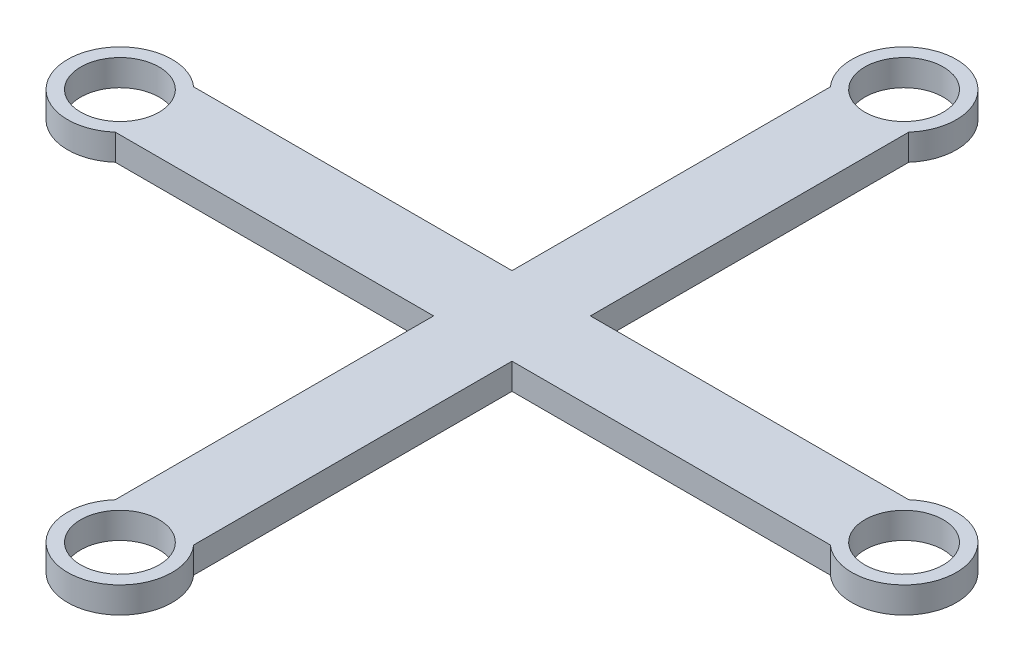
ISO-10303-21;
HEADER;
FILE_DESCRIPTION(('STEP AP214'),'2;1');
FILE_NAME('part.step','',(''),(''),'','','');
FILE_SCHEMA(('AUTOMOTIVE_DESIGN { 1 0 10303 214 1 1 1 1 }'));
ENDSEC;
DATA;
#1=APPLICATION_CONTEXT('core data for automotive mechanical design processes');
#2=APPLICATION_PROTOCOL_DEFINITION('international standard','automotive_design',2000,#1);
#3=PRODUCT_CONTEXT('',#1,'mechanical');
#4=PRODUCT('Part','Part','',(#3));
#5=PRODUCT_RELATED_PRODUCT_CATEGORY('part','',(#4));
#6=PRODUCT_DEFINITION_FORMATION('','',#4);
#7=PRODUCT_DEFINITION_CONTEXT('part definition',#1,'design');
#8=PRODUCT_DEFINITION('design','',#6,#7);
#9=PRODUCT_DEFINITION_SHAPE('','',#8);
#10=(LENGTH_UNIT() NAMED_UNIT(*) SI_UNIT(.MILLI.,.METRE.));
#11=(NAMED_UNIT(*) PLANE_ANGLE_UNIT() SI_UNIT($,.RADIAN.));
#12=(NAMED_UNIT(*) SI_UNIT($,.STERADIAN.) SOLID_ANGLE_UNIT());
#13=UNCERTAINTY_MEASURE_WITH_UNIT(LENGTH_MEASURE(1.E-05),#10,'distance_accuracy_value','');
#14=(GEOMETRIC_REPRESENTATION_CONTEXT(3) GLOBAL_UNCERTAINTY_ASSIGNED_CONTEXT((#13)) GLOBAL_UNIT_ASSIGNED_CONTEXT((#10,
#11,#12)) REPRESENTATION_CONTEXT('',''));
#15=CARTESIAN_POINT('',(0.,0.,0.));
#16=DIRECTION('',(0.,0.,1.));
#17=DIRECTION('',(1.,0.,0.));
#18=AXIS2_PLACEMENT_3D('',#15,#16,#17);
#19=CARTESIAN_POINT('',(-15.,10.,0.));
#20=DIRECTION('',(-1.,0.,0.));
#21=DIRECTION('',(0.,0.,1.));
#22=AXIS2_PLACEMENT_3D('',#19,#20,#21);
#23=PLANE('',#22);
#24=DIRECTION('',(0.,0.,-1.));
#25=VECTOR('',#24,1.);
#26=CARTESIAN_POINT('',(-15.,0.,0.));
#27=LINE('',#26,#25);
#28=CARTESIAN_POINT('',(-15.,0.,136.771243444677));
#29=VERTEX_POINT('',#28);
#30=CARTESIAN_POINT('',(-15.,0.,15.));
#31=VERTEX_POINT('',#30);
#32=EDGE_CURVE('E174',#29,#31,#27,.T.);
#33=ORIENTED_EDGE('',*,*,#32,.F.);
#34=DIRECTION('',(0.,-1.,0.));
#35=VECTOR('',#34,1.);
#36=CARTESIAN_POINT('',(-15.,10.,136.771243444677));
#37=LINE('',#36,#35);
#38=CARTESIAN_POINT('',(-15.,10.,136.771243444677));
#39=VERTEX_POINT('',#38);
#40=EDGE_CURVE('E11',#39,#29,#37,.T.);
#41=ORIENTED_EDGE('',*,*,#40,.F.);
#42=DIRECTION('',(0.,0.,-1.));
#43=VECTOR('',#42,1.);
#44=CARTESIAN_POINT('',(-15.,10.,0.));
#45=LINE('',#44,#43);
#46=CARTESIAN_POINT('',(-15.,10.,15.));
#47=VERTEX_POINT('',#46);
#48=EDGE_CURVE('E306',#39,#47,#45,.T.);
#49=ORIENTED_EDGE('',*,*,#48,.T.);
#50=DIRECTION('',(0.,-1.,0.));
#51=VECTOR('',#50,1.);
#52=CARTESIAN_POINT('',(-15.,10.,15.));
#53=LINE('',#52,#51);
#54=EDGE_CURVE('E103',#47,#31,#53,.T.);
#55=ORIENTED_EDGE('',*,*,#54,.T.);
#56=EDGE_LOOP('',(#33,#41,#49,#55));
#57=FACE_BOUND('',#56,.T.);
#58=ADVANCED_FACE('F39',(#57),#23,.T.);
#59=CARTESIAN_POINT('',(0.,10.,150.));
#60=DIRECTION('',(0.,-1.,0.));
#61=DIRECTION('',(0.,0.,-1.));
#62=AXIS2_PLACEMENT_3D('',#59,#60,#61);
#63=CYLINDRICAL_SURFACE('',#62,20.);
#64=CARTESIAN_POINT('',(0.,0.,150.));
#65=DIRECTION('',(0.,1.,0.));
#66=DIRECTION('',(0.,0.,1.));
#67=AXIS2_PLACEMENT_3D('',#64,#65,#66);
#68=CIRCLE('',#67,20.);
#69=CARTESIAN_POINT('',(15.,0.,136.771243444677));
#70=VERTEX_POINT('',#69);
#71=EDGE_CURVE('E176',#29,#70,#68,.T.);
#72=ORIENTED_EDGE('',*,*,#71,.T.);
#73=DIRECTION('',(0.,-1.,0.));
#74=VECTOR('',#73,1.);
#75=CARTESIAN_POINT('',(15.,10.,136.771243444677));
#76=LINE('',#75,#74);
#77=CARTESIAN_POINT('',(15.,10.,136.771243444677));
#78=VERTEX_POINT('',#77);
#79=EDGE_CURVE('E48',#78,#70,#76,.T.);
#80=ORIENTED_EDGE('',*,*,#79,.F.);
#81=CARTESIAN_POINT('',(0.,10.,150.));
#82=DIRECTION('',(0.,1.,0.));
#83=DIRECTION('',(0.,0.,1.));
#84=AXIS2_PLACEMENT_3D('',#81,#82,#83);
#85=CIRCLE('',#84,20.);
#86=EDGE_CURVE('E308',#39,#78,#85,.T.);
#87=ORIENTED_EDGE('',*,*,#86,.F.);
#88=ORIENTED_EDGE('',*,*,#40,.T.);
#89=EDGE_LOOP('',(#72,#80,#87,#88));
#90=FACE_BOUND('',#89,.T.);
#91=ADVANCED_FACE('F241',(#90),#63,.T.);
#92=CARTESIAN_POINT('',(15.,10.,0.));
#93=DIRECTION('',(-1.,0.,0.));
#94=DIRECTION('',(0.,0.,1.));
#95=AXIS2_PLACEMENT_3D('',#92,#93,#94);
#96=PLANE('',#95);
#97=DIRECTION('',(0.,0.,-1.));
#98=VECTOR('',#97,1.);
#99=CARTESIAN_POINT('',(15.,0.,0.));
#100=LINE('',#99,#98);
#101=CARTESIAN_POINT('',(15.,0.,15.));
#102=VERTEX_POINT('',#101);
#103=EDGE_CURVE('E179',#70,#102,#100,.T.);
#104=ORIENTED_EDGE('',*,*,#103,.T.);
#105=DIRECTION('',(0.,-1.,0.));
#106=VECTOR('',#105,1.);
#107=CARTESIAN_POINT('',(15.,10.,15.));
#108=LINE('',#107,#106);
#109=CARTESIAN_POINT('',(15.,10.,15.));
#110=VERTEX_POINT('',#109);
#111=EDGE_CURVE('E229',#110,#102,#108,.T.);
#112=ORIENTED_EDGE('',*,*,#111,.F.);
#113=DIRECTION('',(0.,0.,-1.));
#114=VECTOR('',#113,1.);
#115=CARTESIAN_POINT('',(15.,10.,0.));
#116=LINE('',#115,#114);
#117=EDGE_CURVE('E237',#78,#110,#116,.T.);
#118=ORIENTED_EDGE('',*,*,#117,.F.);
#119=ORIENTED_EDGE('',*,*,#79,.T.);
#120=EDGE_LOOP('',(#104,#112,#118,#119));
#121=FACE_BOUND('',#120,.T.);
#122=ADVANCED_FACE('F234',(#121),#96,.F.);
#123=CARTESIAN_POINT('',(0.,10.,15.));
#124=DIRECTION('',(0.,0.,-1.));
#125=DIRECTION('',(-1.,0.,0.));
#126=AXIS2_PLACEMENT_3D('',#123,#124,#125);
#127=PLANE('',#126);
#128=DIRECTION('',(1.,0.,0.));
#129=VECTOR('',#128,1.);
#130=CARTESIAN_POINT('',(0.,0.,15.));
#131=LINE('',#130,#129);
#132=CARTESIAN_POINT('',(136.771243444677,0.,15.));
#133=VERTEX_POINT('',#132);
#134=EDGE_CURVE('E182',#102,#133,#131,.T.);
#135=ORIENTED_EDGE('',*,*,#134,.T.);
#136=DIRECTION('',(0.,-1.,0.));
#137=VECTOR('',#136,1.);
#138=CARTESIAN_POINT('',(136.771243444677,10.,15.));
#139=LINE('',#138,#137);
#140=CARTESIAN_POINT('',(136.771243444677,10.,15.));
#141=VERTEX_POINT('',#140);
#142=EDGE_CURVE('E226',#141,#133,#139,.T.);
#143=ORIENTED_EDGE('',*,*,#142,.F.);
#144=DIRECTION('',(1.,0.,0.));
#145=VECTOR('',#144,1.);
#146=CARTESIAN_POINT('',(0.,10.,15.));
#147=LINE('',#146,#145);
#148=EDGE_CURVE('E313',#110,#141,#147,.T.);
#149=ORIENTED_EDGE('',*,*,#148,.F.);
#150=ORIENTED_EDGE('',*,*,#111,.T.);
#151=EDGE_LOOP('',(#135,#143,#149,#150));
#152=FACE_BOUND('',#151,.T.);
#153=ADVANCED_FACE('F252',(#152),#127,.F.);
#154=CARTESIAN_POINT('',(150.,10.,0.));
#155=DIRECTION('',(0.,-1.,0.));
#156=DIRECTION('',(0.,0.,-1.));
#157=AXIS2_PLACEMENT_3D('',#154,#155,#156);
#158=CYLINDRICAL_SURFACE('',#157,20.);
#159=CARTESIAN_POINT('',(150.,0.,0.));
#160=DIRECTION('',(0.,1.,0.));
#161=DIRECTION('',(0.,0.,1.));
#162=AXIS2_PLACEMENT_3D('',#159,#160,#161);
#163=CIRCLE('',#162,20.);
#164=CARTESIAN_POINT('',(136.771243444677,0.,-15.));
#165=VERTEX_POINT('',#164);
#166=EDGE_CURVE('E185',#133,#165,#163,.T.);
#167=ORIENTED_EDGE('',*,*,#166,.T.);
#168=DIRECTION('',(0.,-1.,0.));
#169=VECTOR('',#168,1.);
#170=CARTESIAN_POINT('',(136.771243444677,10.,-15.));
#171=LINE('',#170,#169);
#172=CARTESIAN_POINT('',(136.771243444677,10.,-15.));
#173=VERTEX_POINT('',#172);
#174=EDGE_CURVE('E224',#173,#165,#171,.T.);
#175=ORIENTED_EDGE('',*,*,#174,.F.);
#176=CARTESIAN_POINT('',(150.,10.,0.));
#177=DIRECTION('',(0.,1.,0.));
#178=DIRECTION('',(0.,0.,1.));
#179=AXIS2_PLACEMENT_3D('',#176,#177,#178);
#180=CIRCLE('',#179,20.);
#181=EDGE_CURVE('E316',#141,#173,#180,.T.);
#182=ORIENTED_EDGE('',*,*,#181,.F.);
#183=ORIENTED_EDGE('',*,*,#142,.T.);
#184=EDGE_LOOP('',(#167,#175,#182,#183));
#185=FACE_BOUND('',#184,.T.);
#186=ADVANCED_FACE('F255',(#185),#158,.T.);
#187=CARTESIAN_POINT('',(0.,10.,-15.));
#188=DIRECTION('',(0.,0.,-1.));
#189=DIRECTION('',(-1.,0.,0.));
#190=AXIS2_PLACEMENT_3D('',#187,#188,#189);
#191=PLANE('',#190);
#192=DIRECTION('',(1.,0.,0.));
#193=VECTOR('',#192,1.);
#194=CARTESIAN_POINT('',(0.,0.,-15.));
#195=LINE('',#194,#193);
#196=CARTESIAN_POINT('',(15.,0.,-15.));
#197=VERTEX_POINT('',#196);
#198=EDGE_CURVE('E188',#197,#165,#195,.T.);
#199=ORIENTED_EDGE('',*,*,#198,.F.);
#200=DIRECTION('',(0.,-1.,0.));
#201=VECTOR('',#200,1.);
#202=CARTESIAN_POINT('',(15.,10.,-15.));
#203=LINE('',#202,#201);
#204=CARTESIAN_POINT('',(15.,10.,-15.));
#205=VERTEX_POINT('',#204);
#206=EDGE_CURVE('E222',#205,#197,#203,.T.);
#207=ORIENTED_EDGE('',*,*,#206,.F.);
#208=DIRECTION('',(1.,0.,0.));
#209=VECTOR('',#208,1.);
#210=CARTESIAN_POINT('',(0.,10.,-15.));
#211=LINE('',#210,#209);
#212=EDGE_CURVE('E318',#205,#173,#211,.T.);
#213=ORIENTED_EDGE('',*,*,#212,.T.);
#214=ORIENTED_EDGE('',*,*,#174,.T.);
#215=EDGE_LOOP('',(#199,#207,#213,#214));
#216=FACE_BOUND('',#215,.T.);
#217=ADVANCED_FACE('F259',(#216),#191,.T.);
#218=CARTESIAN_POINT('',(15.,10.,0.));
#219=DIRECTION('',(-1.,0.,0.));
#220=DIRECTION('',(0.,0.,1.));
#221=AXIS2_PLACEMENT_3D('',#218,#219,#220);
#222=PLANE('',#221);
#223=DIRECTION('',(0.,0.,-1.));
#224=VECTOR('',#223,1.);
#225=CARTESIAN_POINT('',(15.,0.,0.));
#226=LINE('',#225,#224);
#227=CARTESIAN_POINT('',(15.,0.,-136.771243444677));
#228=VERTEX_POINT('',#227);
#229=EDGE_CURVE('E191',#197,#228,#226,.T.);
#230=ORIENTED_EDGE('',*,*,#229,.T.);
#231=DIRECTION('',(0.,-1.,0.));
#232=VECTOR('',#231,1.);
#233=CARTESIAN_POINT('',(15.,10.,-136.771243444677));
#234=LINE('',#233,#232);
#235=CARTESIAN_POINT('',(15.,10.,-136.771243444677));
#236=VERTEX_POINT('',#235);
#237=EDGE_CURVE('E219',#236,#228,#234,.T.);
#238=ORIENTED_EDGE('',*,*,#237,.F.);
#239=DIRECTION('',(0.,0.,-1.));
#240=VECTOR('',#239,1.);
#241=CARTESIAN_POINT('',(15.,10.,0.));
#242=LINE('',#241,#240);
#243=EDGE_CURVE('E321',#205,#236,#242,.T.);
#244=ORIENTED_EDGE('',*,*,#243,.F.);
#245=ORIENTED_EDGE('',*,*,#206,.T.);
#246=EDGE_LOOP('',(#230,#238,#244,#245));
#247=FACE_BOUND('',#246,.T.);
#248=ADVANCED_FACE('F263',(#247),#222,.F.);
#249=CARTESIAN_POINT('',(0.,10.,-150.));
#250=DIRECTION('',(0.,-1.,0.));
#251=DIRECTION('',(0.,0.,-1.));
#252=AXIS2_PLACEMENT_3D('',#249,#250,#251);
#253=CYLINDRICAL_SURFACE('',#252,20.);
#254=CARTESIAN_POINT('',(0.,0.,-150.));
#255=DIRECTION('',(0.,1.,0.));
#256=DIRECTION('',(0.,0.,1.));
#257=AXIS2_PLACEMENT_3D('',#254,#255,#256);
#258=CIRCLE('',#257,20.);
#259=CARTESIAN_POINT('',(-15.,0.,-136.771243444677));
#260=VERTEX_POINT('',#259);
#261=EDGE_CURVE('E194',#228,#260,#258,.T.);
#262=ORIENTED_EDGE('',*,*,#261,.T.);
#263=DIRECTION('',(0.,-1.,0.));
#264=VECTOR('',#263,1.);
#265=CARTESIAN_POINT('',(-15.,10.,-136.771243444677));
#266=LINE('',#265,#264);
#267=CARTESIAN_POINT('',(-15.,10.,-136.771243444677));
#268=VERTEX_POINT('',#267);
#269=EDGE_CURVE('E217',#268,#260,#266,.T.);
#270=ORIENTED_EDGE('',*,*,#269,.F.);
#271=CARTESIAN_POINT('',(0.,10.,-150.));
#272=DIRECTION('',(0.,1.,0.));
#273=DIRECTION('',(0.,0.,1.));
#274=AXIS2_PLACEMENT_3D('',#271,#272,#273);
#275=CIRCLE('',#274,20.);
#276=EDGE_CURVE('E157',#236,#268,#275,.T.);
#277=ORIENTED_EDGE('',*,*,#276,.F.);
#278=ORIENTED_EDGE('',*,*,#237,.T.);
#279=EDGE_LOOP('',(#262,#270,#277,#278));
#280=FACE_BOUND('',#279,.T.);
#281=ADVANCED_FACE('F267',(#280),#253,.T.);
#282=CARTESIAN_POINT('',(-15.,10.,0.));
#283=DIRECTION('',(-1.,0.,0.));
#284=DIRECTION('',(0.,0.,1.));
#285=AXIS2_PLACEMENT_3D('',#282,#283,#284);
#286=PLANE('',#285);
#287=DIRECTION('',(0.,0.,-1.));
#288=VECTOR('',#287,1.);
#289=CARTESIAN_POINT('',(-15.,0.,0.));
#290=LINE('',#289,#288);
#291=CARTESIAN_POINT('',(-15.,0.,-15.));
#292=VERTEX_POINT('',#291);
#293=EDGE_CURVE('E197',#292,#260,#290,.T.);
#294=ORIENTED_EDGE('',*,*,#293,.F.);
#295=DIRECTION('',(0.,-1.,0.));
#296=VECTOR('',#295,1.);
#297=CARTESIAN_POINT('',(-15.,10.,-15.));
#298=LINE('',#297,#296);
#299=CARTESIAN_POINT('',(-15.,10.,-15.));
#300=VERTEX_POINT('',#299);
#301=EDGE_CURVE('E144',#300,#292,#298,.T.);
#302=ORIENTED_EDGE('',*,*,#301,.F.);
#303=DIRECTION('',(0.,0.,-1.));
#304=VECTOR('',#303,1.);
#305=CARTESIAN_POINT('',(-15.,10.,0.));
#306=LINE('',#305,#304);
#307=EDGE_CURVE('E155',#300,#268,#306,.T.);
#308=ORIENTED_EDGE('',*,*,#307,.T.);
#309=ORIENTED_EDGE('',*,*,#269,.T.);
#310=EDGE_LOOP('',(#294,#302,#308,#309));
#311=FACE_BOUND('',#310,.T.);
#312=ADVANCED_FACE('F271',(#311),#286,.T.);
#313=CARTESIAN_POINT('',(0.,10.,-15.));
#314=DIRECTION('',(0.,0.,-1.));
#315=DIRECTION('',(-1.,0.,0.));
#316=AXIS2_PLACEMENT_3D('',#313,#314,#315);
#317=PLANE('',#316);
#318=DIRECTION('',(1.,0.,0.));
#319=VECTOR('',#318,1.);
#320=CARTESIAN_POINT('',(0.,0.,-15.));
#321=LINE('',#320,#319);
#322=CARTESIAN_POINT('',(-136.771243444677,0.,-15.));
#323=VERTEX_POINT('',#322);
#324=EDGE_CURVE('E141',#323,#292,#321,.T.);
#325=ORIENTED_EDGE('',*,*,#324,.F.);
#326=DIRECTION('',(0.,-1.,0.));
#327=VECTOR('',#326,1.);
#328=CARTESIAN_POINT('',(-136.771243444677,10.,-15.));
#329=LINE('',#328,#327);
#330=CARTESIAN_POINT('',(-136.771243444677,10.,-15.));
#331=VERTEX_POINT('',#330);
#332=EDGE_CURVE('E135',#331,#323,#329,.T.);
#333=ORIENTED_EDGE('',*,*,#332,.F.);
#334=DIRECTION('',(1.,0.,0.));
#335=VECTOR('',#334,1.);
#336=CARTESIAN_POINT('',(0.,10.,-15.));
#337=LINE('',#336,#335);
#338=EDGE_CURVE('E139',#331,#300,#337,.T.);
#339=ORIENTED_EDGE('',*,*,#338,.T.);
#340=ORIENTED_EDGE('',*,*,#301,.T.);
#341=EDGE_LOOP('',(#325,#333,#339,#340));
#342=FACE_BOUND('',#341,.T.);
#343=ADVANCED_FACE('F137',(#342),#317,.T.);
#344=CARTESIAN_POINT('',(-150.,10.,0.));
#345=DIRECTION('',(0.,-1.,0.));
#346=DIRECTION('',(0.,0.,-1.));
#347=AXIS2_PLACEMENT_3D('',#344,#345,#346);
#348=CYLINDRICAL_SURFACE('',#347,20.);
#349=CARTESIAN_POINT('',(-150.,0.,0.));
#350=DIRECTION('',(0.,1.,0.));
#351=DIRECTION('',(0.,0.,1.));
#352=AXIS2_PLACEMENT_3D('',#349,#350,#351);
#353=CIRCLE('',#352,20.);
#354=CARTESIAN_POINT('',(-136.771243444677,0.,15.));
#355=VERTEX_POINT('',#354);
#356=EDGE_CURVE('E201',#323,#355,#353,.T.);
#357=ORIENTED_EDGE('',*,*,#356,.T.);
#358=DIRECTION('',(0.,-1.,0.));
#359=VECTOR('',#358,1.);
#360=CARTESIAN_POINT('',(-136.771243444677,10.,15.));
#361=LINE('',#360,#359);
#362=CARTESIAN_POINT('',(-136.771243444677,10.,15.));
#363=VERTEX_POINT('',#362);
#364=EDGE_CURVE('E145',#363,#355,#361,.T.);
#365=ORIENTED_EDGE('',*,*,#364,.F.);
#366=CARTESIAN_POINT('',(-150.,10.,0.));
#367=DIRECTION('',(0.,1.,0.));
#368=DIRECTION('',(0.,0.,1.));
#369=AXIS2_PLACEMENT_3D('',#366,#367,#368);
#370=CIRCLE('',#369,20.);
#371=EDGE_CURVE('E148',#331,#363,#370,.T.);
#372=ORIENTED_EDGE('',*,*,#371,.F.);
#373=ORIENTED_EDGE('',*,*,#332,.T.);
#374=EDGE_LOOP('',(#357,#365,#372,#373));
#375=FACE_BOUND('',#374,.T.);
#376=ADVANCED_FACE('F149',(#375),#348,.T.);
#377=CARTESIAN_POINT('',(150.,10.,0.));
#378=DIRECTION('',(0.,-1.,0.));
#379=DIRECTION('',(0.,0.,-1.));
#380=AXIS2_PLACEMENT_3D('',#377,#378,#379);
#381=CYLINDRICAL_SURFACE('',#380,15.);
#382=CARTESIAN_POINT('',(150.,10.,0.));
#383=DIRECTION('',(0.,1.,0.));
#384=DIRECTION('',(0.,0.,1.));
#385=AXIS2_PLACEMENT_3D('',#382,#383,#384);
#386=CIRCLE('',#385,15.);
#387=CARTESIAN_POINT('',(150.,10.,15.));
#388=VERTEX_POINT('',#387);
#389=EDGE_CURVE('E165',#388,#388,#386,.T.);
#390=ORIENTED_EDGE('',*,*,#389,.T.);
#391=EDGE_LOOP('',(#390));
#392=FACE_BOUND('',#391,.T.);
#393=CARTESIAN_POINT('',(150.,0.,0.));
#394=DIRECTION('',(0.,1.,0.));
#395=DIRECTION('',(0.,0.,1.));
#396=AXIS2_PLACEMENT_3D('',#393,#394,#395);
#397=CIRCLE('',#396,15.);
#398=CARTESIAN_POINT('',(150.,0.,15.));
#399=VERTEX_POINT('',#398);
#400=EDGE_CURVE('E207',#399,#399,#397,.T.);
#401=ORIENTED_EDGE('',*,*,#400,.F.);
#402=EDGE_LOOP('',(#401));
#403=FACE_BOUND('',#402,.T.);
#404=ADVANCED_FACE('F280',(#392,#403),#381,.F.);
#405=CARTESIAN_POINT('',(0.,10.,-150.));
#406=DIRECTION('',(0.,-1.,0.));
#407=DIRECTION('',(0.,0.,-1.));
#408=AXIS2_PLACEMENT_3D('',#405,#406,#407);
#409=CYLINDRICAL_SURFACE('',#408,15.);
#410=CARTESIAN_POINT('',(0.,10.,-150.));
#411=DIRECTION('',(0.,1.,0.));
#412=DIRECTION('',(0.,0.,1.));
#413=AXIS2_PLACEMENT_3D('',#410,#411,#412);
#414=CIRCLE('',#413,15.);
#415=CARTESIAN_POINT('',(0.,10.,-135.));
#416=VERTEX_POINT('',#415);
#417=EDGE_CURVE('E162',#416,#416,#414,.T.);
#418=ORIENTED_EDGE('',*,*,#417,.T.);
#419=EDGE_LOOP('',(#418));
#420=FACE_BOUND('',#419,.T.);
#421=CARTESIAN_POINT('',(0.,0.,-150.));
#422=DIRECTION('',(0.,1.,0.));
#423=DIRECTION('',(0.,0.,1.));
#424=AXIS2_PLACEMENT_3D('',#421,#422,#423);
#425=CIRCLE('',#424,15.);
#426=CARTESIAN_POINT('',(0.,0.,-135.));
#427=VERTEX_POINT('',#426);
#428=EDGE_CURVE('E204',#427,#427,#425,.T.);
#429=ORIENTED_EDGE('',*,*,#428,.F.);
#430=EDGE_LOOP('',(#429));
#431=FACE_BOUND('',#430,.T.);
#432=ADVANCED_FACE('F284',(#420,#431),#409,.F.);
#433=CARTESIAN_POINT('',(0.,10.,15.));
#434=DIRECTION('',(0.,0.,-1.));
#435=DIRECTION('',(-1.,0.,0.));
#436=AXIS2_PLACEMENT_3D('',#433,#434,#435);
#437=PLANE('',#436);
#438=DIRECTION('',(1.,0.,0.));
#439=VECTOR('',#438,1.);
#440=CARTESIAN_POINT('',(0.,0.,15.));
#441=LINE('',#440,#439);
#442=EDGE_CURVE('E96',#355,#31,#441,.T.);
#443=ORIENTED_EDGE('',*,*,#442,.T.);
#444=ORIENTED_EDGE('',*,*,#54,.F.);
#445=DIRECTION('',(1.,0.,0.));
#446=VECTOR('',#445,1.);
#447=CARTESIAN_POINT('',(0.,10.,15.));
#448=LINE('',#447,#446);
#449=EDGE_CURVE('E56',#363,#47,#448,.T.);
#450=ORIENTED_EDGE('',*,*,#449,.F.);
#451=ORIENTED_EDGE('',*,*,#364,.T.);
#452=EDGE_LOOP('',(#443,#444,#450,#451));
#453=FACE_BOUND('',#452,.T.);
#454=ADVANCED_FACE('F281',(#453),#437,.F.);
#455=CARTESIAN_POINT('',(0.,10.,150.));
#456=DIRECTION('',(0.,-1.,0.));
#457=DIRECTION('',(0.,0.,-1.));
#458=AXIS2_PLACEMENT_3D('',#455,#456,#457);
#459=CYLINDRICAL_SURFACE('',#458,15.);
#460=CARTESIAN_POINT('',(0.,10.,150.));
#461=DIRECTION('',(0.,1.,0.));
#462=DIRECTION('',(0.,0.,1.));
#463=AXIS2_PLACEMENT_3D('',#460,#461,#462);
#464=CIRCLE('',#463,15.);
#465=CARTESIAN_POINT('',(0.,10.,165.));
#466=VERTEX_POINT('',#465);
#467=EDGE_CURVE('E213',#466,#466,#464,.T.);
#468=ORIENTED_EDGE('',*,*,#467,.T.);
#469=EDGE_LOOP('',(#468));
#470=FACE_BOUND('',#469,.T.);
#471=CARTESIAN_POINT('',(0.,0.,150.));
#472=DIRECTION('',(0.,1.,0.));
#473=DIRECTION('',(0.,0.,1.));
#474=AXIS2_PLACEMENT_3D('',#471,#472,#473);
#475=CIRCLE('',#474,15.);
#476=CARTESIAN_POINT('',(0.,0.,165.));
#477=VERTEX_POINT('',#476);
#478=EDGE_CURVE('E171',#477,#477,#475,.T.);
#479=ORIENTED_EDGE('',*,*,#478,.F.);
#480=EDGE_LOOP('',(#479));
#481=FACE_BOUND('',#480,.T.);
#482=ADVANCED_FACE('F41',(#470,#481),#459,.F.);
#483=CARTESIAN_POINT('',(-150.,10.,0.));
#484=DIRECTION('',(0.,-1.,0.));
#485=DIRECTION('',(0.,0.,-1.));
#486=AXIS2_PLACEMENT_3D('',#483,#484,#485);
#487=CYLINDRICAL_SURFACE('',#486,15.);
#488=CARTESIAN_POINT('',(-150.,10.,0.));
#489=DIRECTION('',(0.,1.,0.));
#490=DIRECTION('',(0.,0.,1.));
#491=AXIS2_PLACEMENT_3D('',#488,#489,#490);
#492=CIRCLE('',#491,15.);
#493=CARTESIAN_POINT('',(-150.,10.,15.));
#494=VERTEX_POINT('',#493);
#495=EDGE_CURVE('E168',#494,#494,#492,.T.);
#496=ORIENTED_EDGE('',*,*,#495,.T.);
#497=EDGE_LOOP('',(#496));
#498=FACE_BOUND('',#497,.T.);
#499=CARTESIAN_POINT('',(-150.,0.,0.));
#500=DIRECTION('',(0.,1.,0.));
#501=DIRECTION('',(0.,0.,1.));
#502=AXIS2_PLACEMENT_3D('',#499,#500,#501);
#503=CIRCLE('',#502,15.);
#504=CARTESIAN_POINT('',(-150.,0.,15.));
#505=VERTEX_POINT('',#504);
#506=EDGE_CURVE('E210',#505,#505,#503,.T.);
#507=ORIENTED_EDGE('',*,*,#506,.F.);
#508=EDGE_LOOP('',(#507));
#509=FACE_BOUND('',#508,.T.);
#510=ADVANCED_FACE('F292',(#498,#509),#487,.F.);
#511=CARTESIAN_POINT('',(0.,10.,0.));
#512=DIRECTION('',(0.,1.,0.));
#513=DIRECTION('',(0.,0.,1.));
#514=AXIS2_PLACEMENT_3D('',#511,#512,#513);
#515=PLANE('',#514);
#516=ORIENTED_EDGE('',*,*,#467,.F.);
#517=EDGE_LOOP('',(#516));
#518=FACE_BOUND('',#517,.T.);
#519=ORIENTED_EDGE('',*,*,#48,.F.);
#520=ORIENTED_EDGE('',*,*,#86,.T.);
#521=ORIENTED_EDGE('',*,*,#117,.T.);
#522=ORIENTED_EDGE('',*,*,#148,.T.);
#523=ORIENTED_EDGE('',*,*,#181,.T.);
#524=ORIENTED_EDGE('',*,*,#212,.F.);
#525=ORIENTED_EDGE('',*,*,#243,.T.);
#526=ORIENTED_EDGE('',*,*,#276,.T.);
#527=ORIENTED_EDGE('',*,*,#307,.F.);
#528=ORIENTED_EDGE('',*,*,#338,.F.);
#529=ORIENTED_EDGE('',*,*,#371,.T.);
#530=ORIENTED_EDGE('',*,*,#449,.T.);
#531=EDGE_LOOP('',(#519,#520,#521,#522,#523,#524,#525,#526,#527,#528,#529,#530));
#532=FACE_BOUND('',#531,.T.);
#533=ORIENTED_EDGE('',*,*,#417,.F.);
#534=EDGE_LOOP('',(#533));
#535=FACE_BOUND('',#534,.T.);
#536=ORIENTED_EDGE('',*,*,#389,.F.);
#537=EDGE_LOOP('',(#536));
#538=FACE_BOUND('',#537,.T.);
#539=ORIENTED_EDGE('',*,*,#495,.F.);
#540=EDGE_LOOP('',(#539));
#541=FACE_BOUND('',#540,.T.);
#542=ADVANCED_FACE('F152',(#518,#532,#535,#538,#541),#515,.T.);
#543=CARTESIAN_POINT('',(0.,0.,0.));
#544=DIRECTION('',(0.,1.,0.));
#545=DIRECTION('',(0.,0.,1.));
#546=AXIS2_PLACEMENT_3D('',#543,#544,#545);
#547=PLANE('',#546);
#548=ORIENTED_EDGE('',*,*,#478,.T.);
#549=EDGE_LOOP('',(#548));
#550=FACE_BOUND('',#549,.T.);
#551=ORIENTED_EDGE('',*,*,#32,.T.);
#552=ORIENTED_EDGE('',*,*,#442,.F.);
#553=ORIENTED_EDGE('',*,*,#356,.F.);
#554=ORIENTED_EDGE('',*,*,#324,.T.);
#555=ORIENTED_EDGE('',*,*,#293,.T.);
#556=ORIENTED_EDGE('',*,*,#261,.F.);
#557=ORIENTED_EDGE('',*,*,#229,.F.);
#558=ORIENTED_EDGE('',*,*,#198,.T.);
#559=ORIENTED_EDGE('',*,*,#166,.F.);
#560=ORIENTED_EDGE('',*,*,#134,.F.);
#561=ORIENTED_EDGE('',*,*,#103,.F.);
#562=ORIENTED_EDGE('',*,*,#71,.F.);
#563=EDGE_LOOP('',(#551,#552,#553,#554,#555,#556,#557,#558,#559,#560,#561,#562));
#564=FACE_BOUND('',#563,.T.);
#565=ORIENTED_EDGE('',*,*,#428,.T.);
#566=EDGE_LOOP('',(#565));
#567=FACE_BOUND('',#566,.T.);
#568=ORIENTED_EDGE('',*,*,#400,.T.);
#569=EDGE_LOOP('',(#568));
#570=FACE_BOUND('',#569,.T.);
#571=ORIENTED_EDGE('',*,*,#506,.T.);
#572=EDGE_LOOP('',(#571));
#573=FACE_BOUND('',#572,.T.);
#574=ADVANCED_FACE('F242',(#550,#564,#567,#570,#573),#547,.F.);
#575=CLOSED_SHELL('',(#58,#91,#122,#153,#186,#217,#248,#281,#312,#343,#376,#404,#432,#454,#482,
#510,#542,#574));
#576=MANIFOLD_SOLID_BREP('B2',#575);
#577=ADVANCED_BREP_SHAPE_REPRESENTATION('',(#18,#576),#14);
#578=SHAPE_DEFINITION_REPRESENTATION(#9,#577);
ENDSEC;
END-ISO-10303-21;
